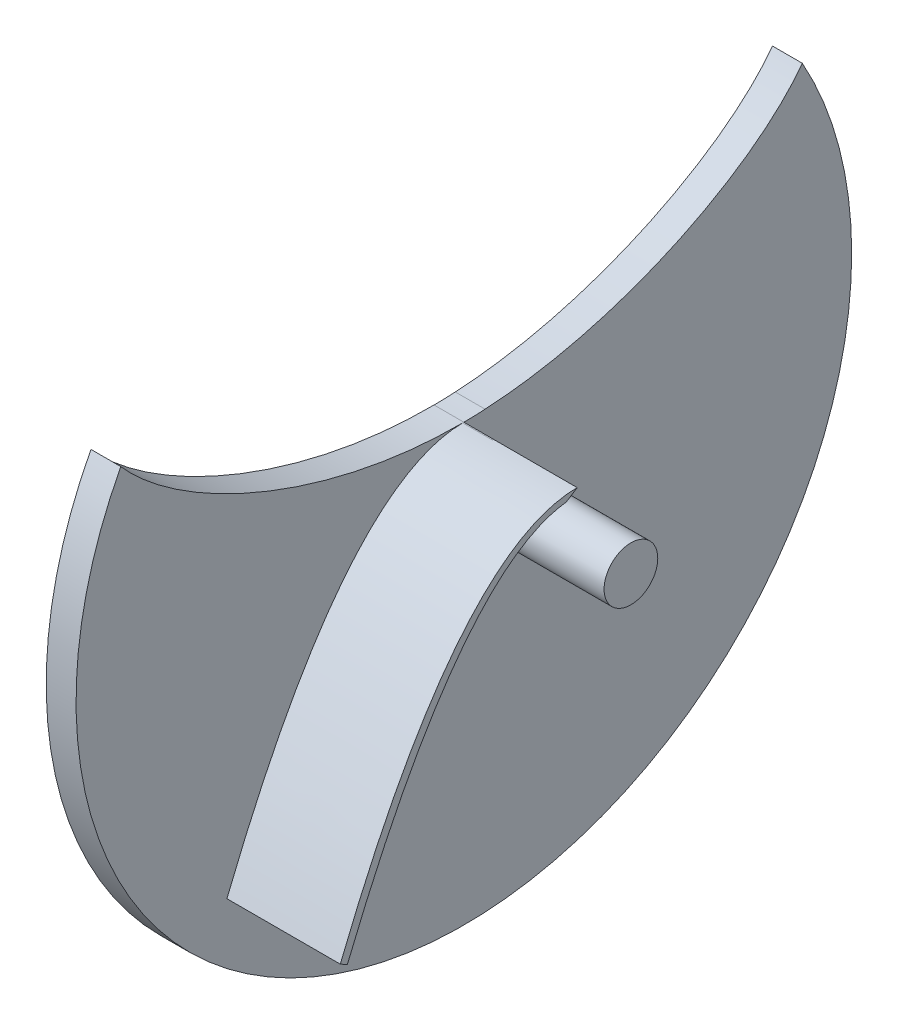
ISO-10303-21;
HEADER;
FILE_DESCRIPTION(('STEP AP214'),'2;1');
FILE_NAME('part.step','',(''),(''),'','','');
FILE_SCHEMA(('AUTOMOTIVE_DESIGN { 1 0 10303 214 1 1 1 1 }'));
ENDSEC;
DATA;
#1=APPLICATION_CONTEXT('core data for automotive mechanical design processes');
#2=APPLICATION_PROTOCOL_DEFINITION('international standard','automotive_design',2000,#1);
#3=PRODUCT_CONTEXT('',#1,'mechanical');
#4=PRODUCT('Part','Part','',(#3));
#5=PRODUCT_RELATED_PRODUCT_CATEGORY('part','',(#4));
#6=PRODUCT_DEFINITION_FORMATION('','',#4);
#7=PRODUCT_DEFINITION_CONTEXT('part definition',#1,'design');
#8=PRODUCT_DEFINITION('design','',#6,#7);
#9=PRODUCT_DEFINITION_SHAPE('','',#8);
#10=(LENGTH_UNIT() NAMED_UNIT(*) SI_UNIT(.MILLI.,.METRE.));
#11=(NAMED_UNIT(*) PLANE_ANGLE_UNIT() SI_UNIT($,.RADIAN.));
#12=(NAMED_UNIT(*) SI_UNIT($,.STERADIAN.) SOLID_ANGLE_UNIT());
#13=UNCERTAINTY_MEASURE_WITH_UNIT(LENGTH_MEASURE(1.E-05),#10,'distance_accuracy_value','');
#14=(GEOMETRIC_REPRESENTATION_CONTEXT(3) GLOBAL_UNCERTAINTY_ASSIGNED_CONTEXT((#13)) GLOBAL_UNIT_ASSIGNED_CONTEXT((#10,
#11,#12)) REPRESENTATION_CONTEXT('',''));
#15=CARTESIAN_POINT('',(0.,0.,0.));
#16=DIRECTION('',(0.,0.,1.));
#17=DIRECTION('',(1.,0.,0.));
#18=AXIS2_PLACEMENT_3D('',#15,#16,#17);
#19=CARTESIAN_POINT('',(5.,0.,0.));
#20=DIRECTION('',(1.,0.,0.));
#21=DIRECTION('',(0.,0.,-1.));
#22=AXIS2_PLACEMENT_3D('',#19,#20,#21);
#23=PLANE('',#22);
#24=CARTESIAN_POINT('',(5.,41.1618321352474,-59.6113134593231));
#25=CARTESIAN_POINT('',(5.,28.2721333442495,-62.2710211670615));
#26=CARTESIAN_POINT('',(5.,-12.4508043296271,0.725304907829059));
#27=CARTESIAN_POINT('',(5.,64.5897910193997,121.126777354957));
#28=CARTESIAN_POINT('',(5.,64.1090964857585,-54.8762907986546));
#29=CARTESIAN_POINT('',(5.,41.1618321352474,-59.6113134593231));
#30=B_SPLINE_CURVE_WITH_KNOTS('',3,(#24,#25,#26,#27,#28,#29),.UNSPECIFIED.,.T.,.F.,(4,1,1,4),
(0.,0.262262558044601,0.53309938841288,1.),.UNSPECIFIED.);
#31=CARTESIAN_POINT('',(5.,30.3061054955228,57.5025214203189));
#32=VERTEX_POINT('',#31);
#33=CARTESIAN_POINT('',(5.,7.99874469673374,0.200423817577011));
#34=VERTEX_POINT('',#33);
#35=EDGE_CURVE('E196',#32,#34,#30,.F.);
#36=ORIENTED_EDGE('',*,*,#35,.F.);
#37=CARTESIAN_POINT('',(5.,0.,0.));
#38=DIRECTION('',(1.,0.,0.));
#39=DIRECTION('',(0.,0.,-1.));
#40=AXIS2_PLACEMENT_3D('',#37,#38,#39);
#41=CIRCLE('',#40,65.);
#42=CARTESIAN_POINT('',(5.,31.7448610911988,-56.7209290676774));
#43=VERTEX_POINT('',#42);
#44=EDGE_CURVE('E110',#32,#43,#41,.T.);
#45=ORIENTED_EDGE('',*,*,#44,.T.);
#46=CARTESIAN_POINT('',(5.,8.11123790196771,-3.55931832707976));
#47=VERTEX_POINT('',#46);
#48=EDGE_CURVE('E201',#47,#43,#30,.F.);
#49=ORIENTED_EDGE('',*,*,#48,.F.);
#50=CARTESIAN_POINT('',(5.,65.,0.));
#51=DIRECTION('',(1.,0.,0.));
#52=DIRECTION('',(0.,0.,-1.));
#53=AXIS2_PLACEMENT_3D('',#50,#51,#52);
#54=CIRCLE('',#53,57.);
#55=CARTESIAN_POINT('',(5.,8.00000000006662,-8.26272383847027E-09));
#56=VERTEX_POINT('',#55);
#57=EDGE_CURVE('E150',#56,#47,#54,.T.);
#58=ORIENTED_EDGE('',*,*,#57,.F.);
#59=DIRECTION('',(0.,0.536957453796477,-0.843609324754299));
#60=VECTOR('',#59,1.);
#61=CARTESIAN_POINT('',(5.,6.83249580803038,1.83425598458165));
#62=LINE('',#61,#60);
#63=CARTESIAN_POINT('',(5.,6.83249580803038,1.83425598458165));
#64=VERTEX_POINT('',#63);
#65=EDGE_CURVE('E120',#64,#56,#62,.T.);
#66=ORIENTED_EDGE('',*,*,#65,.F.);
#67=CARTESIAN_POINT('',(5.,-999363.258489324,35873.7396248132));
#68=CARTESIAN_POINT('',(5.,999538.208256885,-30614.0139100471));
#69=CARTESIAN_POINT('',(5.,-999685.475875233,25353.4403420482));
#70=B_SPLINE_CURVE_WITH_KNOTS('',2,(#67,#68,#69),.UNSPECIFIED.,.F.,.F.,(3,3),(0.,1.),.UNSPECIFIED.);
#71=CARTESIAN_POINT('',(5.,-41.9541775880994,38.5288195815652));
#72=VERTEX_POINT('',#71);
#73=EDGE_CURVE('E241',#72,#64,#70,.T.);
#74=ORIENTED_EDGE('',*,*,#73,.F.);
#75=DIRECTION('',(0.,0.484064930920411,0.875032080927904));
#76=VECTOR('',#75,1.);
#77=CARTESIAN_POINT('',(5.,-41.9541775932381,38.5288195836329));
#78=LINE('',#77,#76);
#79=CARTESIAN_POINT('',(5.,-41.2965378974532,39.7176184170283));
#80=VERTEX_POINT('',#79);
#81=EDGE_CURVE('E206',#72,#80,#78,.T.);
#82=ORIENTED_EDGE('',*,*,#81,.T.);
#83=CARTESIAN_POINT('',(5.,-999992.,5656.85424949238));
#84=CARTESIAN_POINT('',(5.,1000008.,0.));
#85=CARTESIAN_POINT('',(5.,-999992.,-5656.85424949238));
#86=B_SPLINE_CURVE_WITH_KNOTS('',2,(#83,#84,#85),.UNSPECIFIED.,.F.,.F.,(3,3),(0.,1.),.UNSPECIFIED.);
#87=EDGE_CURVE('E207',#80,#34,#86,.T.);
#88=ORIENTED_EDGE('',*,*,#87,.T.);
#89=EDGE_LOOP('',(#36,#45,#49,#58,#66,#74,#82,#88));
#90=FACE_BOUND('',#89,.T.);
#91=CARTESIAN_POINT('',(5.,0.,0.));
#92=DIRECTION('',(1.,0.,0.));
#93=DIRECTION('',(0.,0.,-1.));
#94=AXIS2_PLACEMENT_3D('',#91,#92,#93);
#95=CIRCLE('',#94,4.5);
#96=CARTESIAN_POINT('',(5.,0.,-4.5));
#97=VERTEX_POINT('',#96);
#98=EDGE_CURVE('E130',#97,#97,#95,.T.);
#99=ORIENTED_EDGE('',*,*,#98,.F.);
#100=EDGE_LOOP('',(#99));
#101=FACE_BOUND('',#100,.T.);
#102=ADVANCED_FACE('F33',(#90,#101),#23,.T.);
#103=CARTESIAN_POINT('',(5.,0.,0.));
#104=DIRECTION('',(-1.,0.,0.));
#105=DIRECTION('',(0.,0.,1.));
#106=AXIS2_PLACEMENT_3D('',#103,#104,#105);
#107=CYLINDRICAL_SURFACE('',#106,65.);
#108=CARTESIAN_POINT('',(0.,0.,0.));
#109=DIRECTION('',(1.,0.,0.));
#110=DIRECTION('',(0.,0.,-1.));
#111=AXIS2_PLACEMENT_3D('',#108,#109,#110);
#112=CIRCLE('',#111,65.);
#113=CARTESIAN_POINT('',(0.,30.3061054955228,57.5025214203189));
#114=VERTEX_POINT('',#113);
#115=CARTESIAN_POINT('',(0.,31.7448610911988,-56.7209290676774));
#116=VERTEX_POINT('',#115);
#117=EDGE_CURVE('E144',#114,#116,#112,.T.);
#118=ORIENTED_EDGE('',*,*,#117,.T.);
#119=DIRECTION('',(-1.,0.,0.));
#120=VECTOR('',#119,1.);
#121=CARTESIAN_POINT('',(10.,31.7448610911989,-56.7209290676774));
#122=LINE('',#121,#120);
#123=EDGE_CURVE('E193',#116,#43,#122,.F.);
#124=ORIENTED_EDGE('',*,*,#123,.T.);
#125=ORIENTED_EDGE('',*,*,#44,.F.);
#126=DIRECTION('',(-1.,0.,0.));
#127=VECTOR('',#126,1.);
#128=CARTESIAN_POINT('',(10.,30.3061054955229,57.502521420319));
#129=LINE('',#128,#127);
#130=EDGE_CURVE('E194',#32,#114,#129,.T.);
#131=ORIENTED_EDGE('',*,*,#130,.T.);
#132=EDGE_LOOP('',(#118,#124,#125,#131));
#133=FACE_BOUND('',#132,.T.);
#134=ADVANCED_FACE('F35',(#133),#107,.T.);
#135=CARTESIAN_POINT('',(0.,0.,0.));
#136=DIRECTION('',(1.,0.,0.));
#137=DIRECTION('',(0.,0.,-1.));
#138=AXIS2_PLACEMENT_3D('',#135,#136,#137);
#139=PLANE('',#138);
#140=ORIENTED_EDGE('',*,*,#117,.F.);
#141=CARTESIAN_POINT('',(0.,41.1618321352474,-59.6113134593231));
#142=CARTESIAN_POINT('',(0.,28.2721333442495,-62.2710211670615));
#143=CARTESIAN_POINT('',(0.,-12.4508043296271,0.725304907829059));
#144=CARTESIAN_POINT('',(0.,64.5897910193997,121.126777354957));
#145=CARTESIAN_POINT('',(0.,64.1090964857585,-54.8762907986546));
#146=CARTESIAN_POINT('',(0.,41.1618321352474,-59.6113134593231));
#147=B_SPLINE_CURVE_WITH_KNOTS('',3,(#141,#142,#143,#144,#145,#146),.UNSPECIFIED.,.T.,.F.,(4,1,
1,4),(0.,0.262262558044601,0.53309938841288,1.),.UNSPECIFIED.);
#148=CARTESIAN_POINT('',(0.,7.99999999999999,-3.82532200848479E-13));
#149=VERTEX_POINT('',#148);
#150=EDGE_CURVE('E188',#149,#114,#147,.T.);
#151=ORIENTED_EDGE('',*,*,#150,.F.);
#152=CARTESIAN_POINT('',(0.,65.,0.));
#153=DIRECTION('',(1.,0.,0.));
#154=DIRECTION('',(0.,0.,-1.));
#155=AXIS2_PLACEMENT_3D('',#152,#153,#154);
#156=CIRCLE('',#155,57.);
#157=CARTESIAN_POINT('',(0.,8.11123790196766,-3.55931832707909));
#158=VERTEX_POINT('',#157);
#159=EDGE_CURVE('E147',#149,#158,#156,.T.);
#160=ORIENTED_EDGE('',*,*,#159,.T.);
#161=EDGE_CURVE('E51',#116,#158,#147,.T.);
#162=ORIENTED_EDGE('',*,*,#161,.F.);
#163=EDGE_LOOP('',(#140,#151,#160,#162));
#164=FACE_BOUND('',#163,.T.);
#165=ADVANCED_FACE('F176',(#164),#139,.F.);
#166=CARTESIAN_POINT('',(0.,65.,0.));
#167=DIRECTION('',(1.,0.,0.));
#168=DIRECTION('',(0.,0.,-1.));
#169=AXIS2_PLACEMENT_3D('',#166,#167,#168);
#170=CYLINDRICAL_SURFACE('',#169,57.);
#171=ORIENTED_EDGE('',*,*,#57,.T.);
#172=DIRECTION('',(-1.,0.,0.));
#173=VECTOR('',#172,1.);
#174=CARTESIAN_POINT('',(10.,8.11123790196771,-3.55931832707977));
#175=LINE('',#174,#173);
#176=EDGE_CURVE('E198',#47,#158,#175,.T.);
#177=ORIENTED_EDGE('',*,*,#176,.T.);
#178=ORIENTED_EDGE('',*,*,#159,.F.);
#179=DIRECTION('',(-1.,0.,0.));
#180=VECTOR('',#179,1.);
#181=CARTESIAN_POINT('',(10.,7.99999999999999,5.01735422883051E-13));
#182=LINE('',#181,#180);
#183=EDGE_CURVE('E195',#149,#56,#182,.F.);
#184=ORIENTED_EDGE('',*,*,#183,.T.);
#185=EDGE_LOOP('',(#171,#177,#178,#184));
#186=FACE_BOUND('',#185,.T.);
#187=ADVANCED_FACE('F165',(#186),#170,.F.);
#188=CARTESIAN_POINT('',(33.,0.,0.));
#189=DIRECTION('',(-1.,0.,0.));
#190=DIRECTION('',(0.,0.,1.));
#191=AXIS2_PLACEMENT_3D('',#188,#189,#190);
#192=CYLINDRICAL_SURFACE('',#191,4.5);
#193=CARTESIAN_POINT('',(33.,0.,0.));
#194=DIRECTION('',(1.,0.,0.));
#195=DIRECTION('',(0.,0.,-1.));
#196=AXIS2_PLACEMENT_3D('',#193,#194,#195);
#197=CIRCLE('',#196,4.5);
#198=CARTESIAN_POINT('',(33.,0.,-4.5));
#199=VERTEX_POINT('',#198);
#200=EDGE_CURVE('E153',#199,#199,#197,.T.);
#201=ORIENTED_EDGE('',*,*,#200,.F.);
#202=EDGE_LOOP('',(#201));
#203=FACE_BOUND('',#202,.T.);
#204=ORIENTED_EDGE('',*,*,#98,.T.);
#205=EDGE_LOOP('',(#204));
#206=FACE_BOUND('',#205,.T.);
#207=ADVANCED_FACE('F162',(#203,#206),#192,.T.);
#208=CARTESIAN_POINT('',(33.,0.,0.));
#209=DIRECTION('',(1.,0.,0.));
#210=DIRECTION('',(0.,0.,-1.));
#211=AXIS2_PLACEMENT_3D('',#208,#209,#210);
#212=PLANE('',#211);
#213=ORIENTED_EDGE('',*,*,#200,.T.);
#214=EDGE_LOOP('',(#213));
#215=FACE_BOUND('',#214,.T.);
#216=ADVANCED_FACE('F160',(#215),#212,.T.);
#217=CARTESIAN_POINT('',(24.,-41.9541775932381,38.5288195836329));
#218=DIRECTION('',(0.,-0.875032080927904,0.484064930920411));
#219=DIRECTION('',(0.,-0.484064930920411,-0.875032080927904));
#220=AXIS2_PLACEMENT_3D('',#217,#218,#219);
#221=PLANE('',#220);
#222=ORIENTED_EDGE('',*,*,#81,.F.);
#223=DIRECTION('',(-1.,0.,0.));
#224=VECTOR('',#223,1.);
#225=CARTESIAN_POINT('',(24.,-41.954177588106,38.5288195815692));
#226=LINE('',#225,#224);
#227=CARTESIAN_POINT('',(24.,-41.954177588106,38.5288195815692));
#228=VERTEX_POINT('',#227);
#229=EDGE_CURVE('E126',#228,#72,#226,.T.);
#230=ORIENTED_EDGE('',*,*,#229,.F.);
#231=DIRECTION('',(0.,0.484064930920411,0.875032080927904));
#232=VECTOR('',#231,1.);
#233=CARTESIAN_POINT('',(24.,-41.9541775932381,38.5288195836329));
#234=LINE('',#233,#232);
#235=CARTESIAN_POINT('',(24.,-41.2965378974532,39.7176184170283));
#236=VERTEX_POINT('',#235);
#237=EDGE_CURVE('E233',#228,#236,#234,.T.);
#238=ORIENTED_EDGE('',*,*,#237,.T.);
#239=DIRECTION('',(-1.,0.,0.));
#240=VECTOR('',#239,1.);
#241=CARTESIAN_POINT('',(24.,-41.2965378974532,39.7176184170283));
#242=LINE('',#241,#240);
#243=EDGE_CURVE('E121',#236,#80,#242,.T.);
#244=ORIENTED_EDGE('',*,*,#243,.T.);
#245=EDGE_LOOP('',(#222,#230,#238,#244));
#246=FACE_BOUND('',#245,.T.);
#247=ADVANCED_FACE('F255',(#246),#221,.T.);
#248=CARTESIAN_POINT('',(24.,-999363.258489324,35873.7396248132));
#249=CARTESIAN_POINT('',(24.,999538.208256885,-30614.0139100471));
#250=CARTESIAN_POINT('',(24.,-999685.475875233,25353.4403420482));
#251=B_SPLINE_CURVE_WITH_KNOTS('',2,(#248,#249,#250),.UNSPECIFIED.,.F.,.F.,(3,3),(0.,1.),.UNSPECIFIED.);
#252=DIRECTION('',(-1.,0.,0.));
#253=VECTOR('',#252,1.);
#254=SURFACE_OF_LINEAR_EXTRUSION('',#251,#253);
#255=ORIENTED_EDGE('',*,*,#73,.T.);
#256=DIRECTION('',(-1.,0.,0.));
#257=VECTOR('',#256,1.);
#258=CARTESIAN_POINT('',(24.,6.83249580803038,1.83425598458165));
#259=LINE('',#258,#257);
#260=CARTESIAN_POINT('',(24.,6.83249580803038,1.83425598458165));
#261=VERTEX_POINT('',#260);
#262=EDGE_CURVE('E125',#261,#64,#259,.T.);
#263=ORIENTED_EDGE('',*,*,#262,.F.);
#264=EDGE_CURVE('E313',#228,#261,#251,.T.);
#265=ORIENTED_EDGE('',*,*,#264,.F.);
#266=ORIENTED_EDGE('',*,*,#229,.T.);
#267=EDGE_LOOP('',(#255,#263,#265,#266));
#268=FACE_BOUND('',#267,.T.);
#269=ADVANCED_FACE('F258',(#268),#254,.F.);
#270=CARTESIAN_POINT('',(24.,6.83249580803038,1.83425598458165));
#271=DIRECTION('',(0.,0.843609324754299,0.536957453796477));
#272=DIRECTION('',(0.,-0.536957453796478,0.843609324754299));
#273=AXIS2_PLACEMENT_3D('',#270,#271,#272);
#274=PLANE('',#273);
#275=ORIENTED_EDGE('',*,*,#65,.T.);
#276=DIRECTION('',(-1.,0.,0.));
#277=VECTOR('',#276,1.);
#278=CARTESIAN_POINT('',(24.,8.00000000006662,-2.66453525910038E-12));
#279=LINE('',#278,#277);
#280=CARTESIAN_POINT('',(10.,8.00000000020715,-2.72077965016872E-08));
#281=VERTEX_POINT('',#280);
#282=EDGE_CURVE('E105',#281,#56,#279,.T.);
#283=ORIENTED_EDGE('',*,*,#282,.F.);
#284=CARTESIAN_POINT('',(24.,8.00000000006662,-2.66453525910038E-12));
#285=VERTEX_POINT('',#284);
#286=EDGE_CURVE('E37',#285,#281,#279,.T.);
#287=ORIENTED_EDGE('',*,*,#286,.F.);
#288=DIRECTION('',(0.,0.536957453796477,-0.843609324754299));
#289=VECTOR('',#288,1.);
#290=CARTESIAN_POINT('',(24.,6.83249580803038,1.83425598458165));
#291=LINE('',#290,#289);
#292=EDGE_CURVE('E246',#261,#285,#291,.T.);
#293=ORIENTED_EDGE('',*,*,#292,.F.);
#294=ORIENTED_EDGE('',*,*,#262,.T.);
#295=EDGE_LOOP('',(#275,#283,#287,#293,#294));
#296=FACE_BOUND('',#295,.T.);
#297=ADVANCED_FACE('F116',(#296),#274,.F.);
#298=CARTESIAN_POINT('',(24.,-999992.,5656.85424949238));
#299=CARTESIAN_POINT('',(24.,1000008.,0.));
#300=CARTESIAN_POINT('',(24.,-999992.,-5656.85424949238));
#301=B_SPLINE_CURVE_WITH_KNOTS('',2,(#298,#299,#300),.UNSPECIFIED.,.F.,.F.,(3,3),(0.,1.),.UNSPECIFIED.);
#302=DIRECTION('',(-1.,0.,0.));
#303=VECTOR('',#302,1.);
#304=SURFACE_OF_LINEAR_EXTRUSION('',#301,#303);
#305=DIRECTION('',(-1.,0.,0.));
#306=VECTOR('',#305,1.);
#307=CARTESIAN_POINT('',(10.,7.99874469673043,0.200423817577374));
#308=LINE('',#307,#306);
#309=CARTESIAN_POINT('',(10.,7.99874470505065,0.200423153629892));
#310=VERTEX_POINT('',#309);
#311=EDGE_CURVE('E11',#34,#310,#308,.F.);
#312=ORIENTED_EDGE('',*,*,#311,.F.);
#313=ORIENTED_EDGE('',*,*,#87,.F.);
#314=ORIENTED_EDGE('',*,*,#243,.F.);
#315=EDGE_CURVE('E124',#236,#285,#301,.T.);
#316=ORIENTED_EDGE('',*,*,#315,.T.);
#317=ORIENTED_EDGE('',*,*,#286,.T.);
#318=CARTESIAN_POINT('',(10.,7.99874469677616,0.200423808271195));
#319=CARTESIAN_POINT('',(10.,7.99907299968715,0.133614771118774));
#320=CARTESIAN_POINT('',(10.,7.99949134906248,0.0668067288729053));
#321=CARTESIAN_POINT('',(10.,7.99999999999999,0.));
#322=B_SPLINE_CURVE_WITH_KNOTS('',3,(#318,#319,#320,#321),.UNSPECIFIED.,.F.,.F.,(4,4),
(0.262262558044601,0.262822698746872),.UNSPECIFIED.);
#323=EDGE_CURVE('E43',#310,#281,#322,.T.);
#324=ORIENTED_EDGE('',*,*,#323,.F.);
#325=EDGE_LOOP('',(#312,#313,#314,#316,#317,#324));
#326=FACE_BOUND('',#325,.T.);
#327=ADVANCED_FACE('F122',(#326),#304,.T.);
#328=CARTESIAN_POINT('',(24.,8.00000000006662,0.));
#329=DIRECTION('',(1.,0.,0.));
#330=DIRECTION('',(0.,0.,-1.));
#331=AXIS2_PLACEMENT_3D('',#328,#329,#330);
#332=PLANE('',#331);
#333=ORIENTED_EDGE('',*,*,#237,.F.);
#334=ORIENTED_EDGE('',*,*,#264,.T.);
#335=ORIENTED_EDGE('',*,*,#292,.T.);
#336=ORIENTED_EDGE('',*,*,#315,.F.);
#337=EDGE_LOOP('',(#333,#334,#335,#336));
#338=FACE_BOUND('',#337,.T.);
#339=ADVANCED_FACE('F228',(#338),#332,.T.);
#340=CARTESIAN_POINT('',(10.,41.1618321352474,-59.6113134593231));
#341=CARTESIAN_POINT('',(10.,28.2721333442495,-62.2710211670615));
#342=CARTESIAN_POINT('',(10.,-12.4508043296271,0.725304907829059));
#343=CARTESIAN_POINT('',(10.,64.5897910193997,121.126777354957));
#344=CARTESIAN_POINT('',(10.,64.1090964857585,-54.8762907986546));
#345=CARTESIAN_POINT('',(10.,41.1618321352474,-59.6113134593231));
#346=B_SPLINE_CURVE_WITH_KNOTS('',3,(#340,#341,#342,#343,#344,#345),.UNSPECIFIED.,.T.,.F.,(4,1,
1,4),(0.,0.262262558044601,0.53309938841288,1.),.UNSPECIFIED.);
#347=DIRECTION('',(-1.,0.,0.));
#348=VECTOR('',#347,1.);
#349=SURFACE_OF_LINEAR_EXTRUSION('',#346,#348);
#350=ORIENTED_EDGE('',*,*,#150,.T.);
#351=ORIENTED_EDGE('',*,*,#130,.F.);
#352=ORIENTED_EDGE('',*,*,#35,.T.);
#353=ORIENTED_EDGE('',*,*,#311,.T.);
#354=ORIENTED_EDGE('',*,*,#323,.T.);
#355=ORIENTED_EDGE('',*,*,#282,.T.);
#356=ORIENTED_EDGE('',*,*,#183,.F.);
#357=EDGE_LOOP('',(#350,#351,#352,#353,#354,#355,#356));
#358=FACE_BOUND('',#357,.T.);
#359=ADVANCED_FACE('F104',(#358),#349,.F.);
#360=ORIENTED_EDGE('',*,*,#161,.T.);
#361=ORIENTED_EDGE('',*,*,#176,.F.);
#362=ORIENTED_EDGE('',*,*,#48,.T.);
#363=ORIENTED_EDGE('',*,*,#123,.F.);
#364=EDGE_LOOP('',(#360,#361,#362,#363));
#365=FACE_BOUND('',#364,.T.);
#366=ADVANCED_FACE('F210',(#365),#349,.F.);
#367=CLOSED_SHELL('',(#102,#134,#165,#187,#207,#216,#247,#269,#297,#327,#339,#359,#366));
#368=MANIFOLD_SOLID_BREP('B2',#367);
#369=ADVANCED_BREP_SHAPE_REPRESENTATION('',(#18,#368),#14);
#370=SHAPE_DEFINITION_REPRESENTATION(#9,#369);
ENDSEC;
END-ISO-10303-21;
